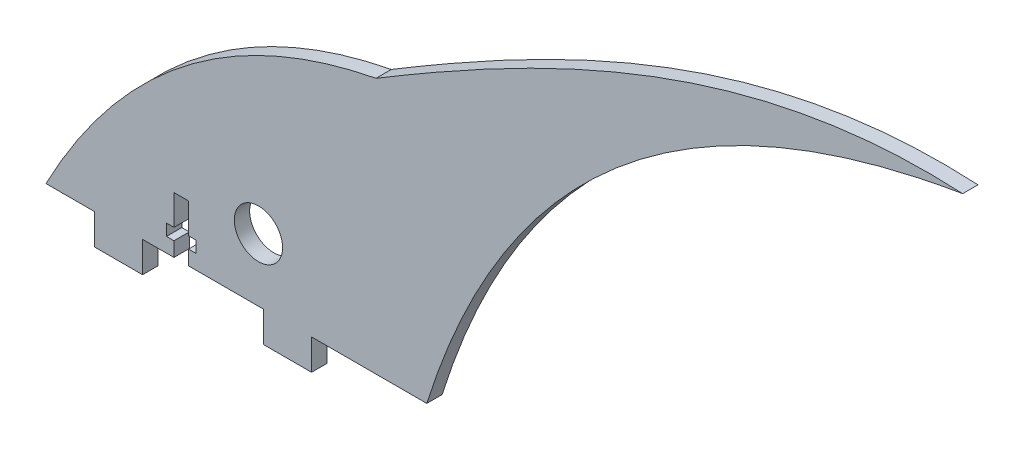
ISO-10303-21;
HEADER;
FILE_DESCRIPTION(('STEP AP214'),'2;1');
FILE_NAME('part.step','',(''),(''),'','','');
FILE_SCHEMA(('AUTOMOTIVE_DESIGN { 1 0 10303 214 1 1 1 1 }'));
ENDSEC;
DATA;
#1=APPLICATION_CONTEXT('core data for automotive mechanical design processes');
#2=APPLICATION_PROTOCOL_DEFINITION('international standard','automotive_design',2000,#1);
#3=PRODUCT_CONTEXT('',#1,'mechanical');
#4=PRODUCT('Part','Part','',(#3));
#5=PRODUCT_RELATED_PRODUCT_CATEGORY('part','',(#4));
#6=PRODUCT_DEFINITION_FORMATION('','',#4);
#7=PRODUCT_DEFINITION_CONTEXT('part definition',#1,'design');
#8=PRODUCT_DEFINITION('design','',#6,#7);
#9=PRODUCT_DEFINITION_SHAPE('','',#8);
#10=(LENGTH_UNIT() NAMED_UNIT(*) SI_UNIT(.MILLI.,.METRE.));
#11=(NAMED_UNIT(*) PLANE_ANGLE_UNIT() SI_UNIT($,.RADIAN.));
#12=(NAMED_UNIT(*) SI_UNIT($,.STERADIAN.) SOLID_ANGLE_UNIT());
#13=UNCERTAINTY_MEASURE_WITH_UNIT(LENGTH_MEASURE(1.E-05),#10,'distance_accuracy_value','');
#14=(GEOMETRIC_REPRESENTATION_CONTEXT(3) GLOBAL_UNCERTAINTY_ASSIGNED_CONTEXT((#13)) GLOBAL_UNIT_ASSIGNED_CONTEXT((#10,
#11,#12)) REPRESENTATION_CONTEXT('',''));
#15=CARTESIAN_POINT('',(0.,0.,0.));
#16=DIRECTION('',(0.,0.,1.));
#17=DIRECTION('',(1.,0.,0.));
#18=AXIS2_PLACEMENT_3D('',#15,#16,#17);
#19=CARTESIAN_POINT('',(-100.609869353649,-40.6042197841452,3.175));
#20=DIRECTION('',(0.,1.,0.));
#21=DIRECTION('',(0.,0.,1.));
#22=AXIS2_PLACEMENT_3D('',#19,#20,#21);
#23=PLANE('',#22);
#24=DIRECTION('',(1.,0.,0.));
#25=VECTOR('',#24,1.);
#26=CARTESIAN_POINT('',(-100.609869353649,-40.6042197841452,3.175));
#27=LINE('',#26,#25);
#28=CARTESIAN_POINT('',(-71.1098693536488,-40.6042197841452,3.175));
#29=VERTEX_POINT('',#28);
#30=CARTESIAN_POINT('',(-55.6098693536488,-40.6042197841452,3.175));
#31=VERTEX_POINT('',#30);
#32=EDGE_CURVE('E537',#29,#31,#27,.T.);
#33=ORIENTED_EDGE('',*,*,#32,.F.);
#34=DIRECTION('',(0.,0.,1.));
#35=VECTOR('',#34,1.);
#36=CARTESIAN_POINT('',(-71.1098693536488,-40.6042197841452,0.));
#37=LINE('',#36,#35);
#38=CARTESIAN_POINT('',(-71.1098693536488,-40.6042197841452,0.));
#39=VERTEX_POINT('',#38);
#40=EDGE_CURVE('E330',#39,#29,#37,.T.);
#41=ORIENTED_EDGE('',*,*,#40,.F.);
#42=DIRECTION('',(1.,0.,0.));
#43=VECTOR('',#42,1.);
#44=CARTESIAN_POINT('',(-100.609869353649,-40.6042197841452,0.));
#45=LINE('',#44,#43);
#46=CARTESIAN_POINT('',(-55.6098693536488,-40.6042197841452,0.));
#47=VERTEX_POINT('',#46);
#48=EDGE_CURVE('E582',#39,#47,#45,.T.);
#49=ORIENTED_EDGE('',*,*,#48,.T.);
#50=DIRECTION('',(0.,0.,1.));
#51=VECTOR('',#50,1.);
#52=CARTESIAN_POINT('',(-55.6098693536488,-40.6042197841452,0.));
#53=LINE('',#52,#51);
#54=EDGE_CURVE('E367',#47,#31,#53,.T.);
#55=ORIENTED_EDGE('',*,*,#54,.T.);
#56=EDGE_LOOP('',(#33,#41,#49,#55));
#57=FACE_BOUND('',#56,.T.);
#58=ADVANCED_FACE('F38',(#57),#23,.F.);
#59=CARTESIAN_POINT('',(-80.6098693536488,-40.6042197841452,0.));
#60=VERTEX_POINT('',#59);
#61=CARTESIAN_POINT('',(-74.1098693536488,-40.6042197841452,0.));
#62=VERTEX_POINT('',#61);
#63=EDGE_CURVE('E583',#60,#62,#45,.T.);
#64=ORIENTED_EDGE('',*,*,#63,.T.);
#65=DIRECTION('',(0.,0.,1.));
#66=VECTOR('',#65,1.);
#67=CARTESIAN_POINT('',(-74.1098693536488,-40.6042197841452,0.));
#68=LINE('',#67,#66);
#69=CARTESIAN_POINT('',(-74.1098693536488,-40.6042197841452,3.175));
#70=VERTEX_POINT('',#69);
#71=EDGE_CURVE('E55',#62,#70,#68,.T.);
#72=ORIENTED_EDGE('',*,*,#71,.T.);
#73=CARTESIAN_POINT('',(-80.6098693536488,-40.6042197841452,3.175));
#74=VERTEX_POINT('',#73);
#75=EDGE_CURVE('E544',#74,#70,#27,.T.);
#76=ORIENTED_EDGE('',*,*,#75,.F.);
#77=DIRECTION('',(0.,0.,1.));
#78=VECTOR('',#77,1.);
#79=CARTESIAN_POINT('',(-80.6098693536488,-40.6042197841452,0.));
#80=LINE('',#79,#78);
#81=EDGE_CURVE('E403',#60,#74,#80,.T.);
#82=ORIENTED_EDGE('',*,*,#81,.F.);
#83=EDGE_LOOP('',(#64,#72,#76,#82));
#84=FACE_BOUND('',#83,.T.);
#85=ADVANCED_FACE('F529',(#84),#23,.F.);
#86=CARTESIAN_POINT('',(-45.6098693536488,-40.6042197841452,3.175));
#87=VERTEX_POINT('',#86);
#88=CARTESIAN_POINT('',(-21.7448416777128,-40.6042197841452,3.175));
#89=VERTEX_POINT('',#88);
#90=EDGE_CURVE('E63',#87,#89,#27,.T.);
#91=ORIENTED_EDGE('',*,*,#90,.F.);
#92=DIRECTION('',(0.,0.,1.));
#93=VECTOR('',#92,1.);
#94=CARTESIAN_POINT('',(-45.6098693536488,-40.6042197841452,0.));
#95=LINE('',#94,#93);
#96=CARTESIAN_POINT('',(-45.6098693536488,-40.6042197841452,0.));
#97=VERTEX_POINT('',#96);
#98=EDGE_CURVE('E372',#97,#87,#95,.T.);
#99=ORIENTED_EDGE('',*,*,#98,.F.);
#100=CARTESIAN_POINT('',(-21.7448416777128,-40.6042197841452,0.));
#101=VERTEX_POINT('',#100);
#102=EDGE_CURVE('E579',#97,#101,#45,.T.);
#103=ORIENTED_EDGE('',*,*,#102,.T.);
#104=DIRECTION('',(0.,0.,-1.));
#105=VECTOR('',#104,1.);
#106=CARTESIAN_POINT('',(-21.7448416777128,-40.6042197841452,3.175));
#107=LINE('',#106,#105);
#108=EDGE_CURVE('E552',#89,#101,#107,.T.);
#109=ORIENTED_EDGE('',*,*,#108,.F.);
#110=EDGE_LOOP('',(#91,#99,#103,#109));
#111=FACE_BOUND('',#110,.T.);
#112=ADVANCED_FACE('F453',(#111),#23,.F.);
#113=CARTESIAN_POINT('',(-21.7448416777128,-40.6042197841452,3.175));
#114=CARTESIAN_POINT('',(2.91962202011833,37.9893924054995,3.175));
#115=CARTESIAN_POINT('',(89.2389787737174,52.5113001322188,3.175));
#116=B_SPLINE_CURVE_WITH_KNOTS('',2,(#113,#114,#115),.UNSPECIFIED.,.F.,.F.,(3,3),(0.,1.),.UNSPECIFIED.);
#117=DIRECTION('',(0.,0.,-1.));
#118=VECTOR('',#117,1.);
#119=SURFACE_OF_LINEAR_EXTRUSION('',#116,#118);
#120=CARTESIAN_POINT('',(-21.7448416777128,-40.6042197841452,0.));
#121=CARTESIAN_POINT('',(2.91962202011833,37.9893924054995,0.));
#122=CARTESIAN_POINT('',(89.2389787737174,52.5113001322188,0.));
#123=B_SPLINE_CURVE_WITH_KNOTS('',2,(#120,#121,#122),.UNSPECIFIED.,.F.,.F.,(3,3),(0.,1.),.UNSPECIFIED.);
#124=CARTESIAN_POINT('',(89.2389787737174,52.5113001322188,0.));
#125=VERTEX_POINT('',#124);
#126=EDGE_CURVE('E406',#101,#125,#123,.T.);
#127=ORIENTED_EDGE('',*,*,#126,.T.);
#128=DIRECTION('',(0.,0.,-1.));
#129=VECTOR('',#128,1.);
#130=CARTESIAN_POINT('',(89.2389787737174,52.5113001322188,3.175));
#131=LINE('',#130,#129);
#132=CARTESIAN_POINT('',(89.2389787737174,52.5113001322188,3.175));
#133=VERTEX_POINT('',#132);
#134=EDGE_CURVE('E11',#133,#125,#131,.T.);
#135=ORIENTED_EDGE('',*,*,#134,.F.);
#136=EDGE_CURVE('E415',#89,#133,#116,.T.);
#137=ORIENTED_EDGE('',*,*,#136,.F.);
#138=ORIENTED_EDGE('',*,*,#108,.T.);
#139=EDGE_LOOP('',(#127,#135,#137,#138));
#140=FACE_BOUND('',#139,.T.);
#141=ADVANCED_FACE('F40',(#140),#119,.F.);
#142=CARTESIAN_POINT('',(89.2389787737174,52.5113001322188,3.175));
#143=CARTESIAN_POINT('',(45.2135954606768,54.960877805964,3.175));
#144=CARTESIAN_POINT('',(4.52272738763104,34.5925622247039,3.175));
#145=CARTESIAN_POINT('',(-32.2599982329968,12.458533918971,3.175));
#146=B_SPLINE_CURVE_WITH_KNOTS('',3,(#142,#143,#144,#145),.UNSPECIFIED.,.F.,.F.,(4,4),(0.,1.),.UNSPECIFIED.);
#147=DIRECTION('',(0.,0.,-1.));
#148=VECTOR('',#147,1.);
#149=SURFACE_OF_LINEAR_EXTRUSION('',#146,#148);
#150=CARTESIAN_POINT('',(89.2389787737174,52.5113001322188,0.));
#151=CARTESIAN_POINT('',(45.2135954606768,54.960877805964,0.));
#152=CARTESIAN_POINT('',(4.52272738763104,34.5925622247039,0.));
#153=CARTESIAN_POINT('',(-32.2599982329968,12.458533918971,0.));
#154=B_SPLINE_CURVE_WITH_KNOTS('',3,(#150,#151,#152,#153),.UNSPECIFIED.,.F.,.F.,(4,4),(0.,1.),.UNSPECIFIED.);
#155=CARTESIAN_POINT('',(-32.2599982329968,12.458533918971,0.));
#156=VERTEX_POINT('',#155);
#157=EDGE_CURVE('E575',#125,#156,#154,.T.);
#158=ORIENTED_EDGE('',*,*,#157,.T.);
#159=DIRECTION('',(0.,0.,-1.));
#160=VECTOR('',#159,1.);
#161=CARTESIAN_POINT('',(-32.2599982329968,12.458533918971,3.175));
#162=LINE('',#161,#160);
#163=CARTESIAN_POINT('',(-32.2599982329968,12.458533918971,3.175));
#164=VERTEX_POINT('',#163);
#165=EDGE_CURVE('E48',#164,#156,#162,.T.);
#166=ORIENTED_EDGE('',*,*,#165,.F.);
#167=EDGE_CURVE('E422',#133,#164,#146,.T.);
#168=ORIENTED_EDGE('',*,*,#167,.F.);
#169=ORIENTED_EDGE('',*,*,#134,.T.);
#170=EDGE_LOOP('',(#158,#166,#168,#169));
#171=FACE_BOUND('',#170,.T.);
#172=ADVANCED_FACE('F440',(#171),#149,.F.);
#173=CARTESIAN_POINT('',(-32.2599982329968,12.458533918971,3.175));
#174=CARTESIAN_POINT('',(-77.388125592225,3.70588688352247,3.175));
#175=CARTESIAN_POINT('',(-100.609869353649,-40.6042197841452,3.175));
#176=B_SPLINE_CURVE_WITH_KNOTS('',2,(#173,#174,#175),.UNSPECIFIED.,.F.,.F.,(3,3),(0.,1.),.UNSPECIFIED.);
#177=DIRECTION('',(0.,0.,-1.));
#178=VECTOR('',#177,1.);
#179=SURFACE_OF_LINEAR_EXTRUSION('',#176,#178);
#180=CARTESIAN_POINT('',(-32.2599982329968,12.458533918971,0.));
#181=CARTESIAN_POINT('',(-77.388125592225,3.70588688352247,0.));
#182=CARTESIAN_POINT('',(-100.609869353649,-40.6042197841452,0.));
#183=B_SPLINE_CURVE_WITH_KNOTS('',2,(#180,#181,#182),.UNSPECIFIED.,.F.,.F.,(3,3),(0.,1.),.UNSPECIFIED.);
#184=CARTESIAN_POINT('',(-100.609869353649,-40.6042197841452,0.));
#185=VERTEX_POINT('',#184);
#186=EDGE_CURVE('E573',#156,#185,#183,.T.);
#187=ORIENTED_EDGE('',*,*,#186,.T.);
#188=DIRECTION('',(0.,0.,-1.));
#189=VECTOR('',#188,1.);
#190=CARTESIAN_POINT('',(-100.609869353649,-40.6042197841452,3.175));
#191=LINE('',#190,#189);
#192=CARTESIAN_POINT('',(-100.609869353649,-40.6042197841452,3.175));
#193=VERTEX_POINT('',#192);
#194=EDGE_CURVE('E556',#193,#185,#191,.T.);
#195=ORIENTED_EDGE('',*,*,#194,.F.);
#196=EDGE_CURVE('E432',#164,#193,#176,.T.);
#197=ORIENTED_EDGE('',*,*,#196,.F.);
#198=ORIENTED_EDGE('',*,*,#165,.T.);
#199=EDGE_LOOP('',(#187,#195,#197,#198));
#200=FACE_BOUND('',#199,.T.);
#201=ADVANCED_FACE('F443',(#200),#179,.F.);
#202=CARTESIAN_POINT('',(-90.6098693536488,-40.6042197841452,0.));
#203=VERTEX_POINT('',#202);
#204=EDGE_CURVE('E423',#185,#203,#45,.T.);
#205=ORIENTED_EDGE('',*,*,#204,.T.);
#206=DIRECTION('',(0.,0.,1.));
#207=VECTOR('',#206,1.);
#208=CARTESIAN_POINT('',(-90.6098693536488,-40.6042197841452,0.));
#209=LINE('',#208,#207);
#210=CARTESIAN_POINT('',(-90.6098693536488,-40.6042197841452,3.175));
#211=VERTEX_POINT('',#210);
#212=EDGE_CURVE('E392',#203,#211,#209,.T.);
#213=ORIENTED_EDGE('',*,*,#212,.T.);
#214=EDGE_CURVE('E545',#193,#211,#27,.T.);
#215=ORIENTED_EDGE('',*,*,#214,.F.);
#216=ORIENTED_EDGE('',*,*,#194,.T.);
#217=EDGE_LOOP('',(#205,#213,#215,#216));
#218=FACE_BOUND('',#217,.T.);
#219=ADVANCED_FACE('F447',(#218),#23,.F.);
#220=CARTESIAN_POINT('',(18.3333452840603,21.9714662897682,3.175));
#221=DIRECTION('',(0.,0.,-1.));
#222=DIRECTION('',(-1.,0.,0.));
#223=AXIS2_PLACEMENT_3D('',#220,#221,#222);
#224=PLANE('',#223);
#225=CARTESIAN_POINT('',(-56.6098693536488,-27.6042197841452,3.175));
#226=DIRECTION('',(0.,0.,1.));
#227=DIRECTION('',(1.,0.,0.));
#228=AXIS2_PLACEMENT_3D('',#225,#226,#227);
#229=CIRCLE('',#228,5.);
#230=CARTESIAN_POINT('',(-51.6098693536488,-27.6042197841452,3.175));
#231=VERTEX_POINT('',#230);
#232=EDGE_CURVE('E305',#231,#231,#229,.T.);
#233=ORIENTED_EDGE('',*,*,#232,.F.);
#234=EDGE_LOOP('',(#233));
#235=FACE_BOUND('',#234,.T.);
#236=DIRECTION('',(1.,0.,0.));
#237=VECTOR('',#236,1.);
#238=CARTESIAN_POINT('',(-71.1098693536488,-37.6042197841452,3.175));
#239=LINE('',#238,#237);
#240=CARTESIAN_POINT('',(-71.1098693536488,-37.6042197841452,3.175));
#241=VERTEX_POINT('',#240);
#242=CARTESIAN_POINT('',(-69.5598693536488,-37.6042197841452,3.175));
#243=VERTEX_POINT('',#242);
#244=EDGE_CURVE('E275',#241,#243,#239,.T.);
#245=ORIENTED_EDGE('',*,*,#244,.F.);
#246=DIRECTION('',(0.,1.,0.));
#247=VECTOR('',#246,1.);
#248=CARTESIAN_POINT('',(-71.1098693536488,-37.6042197841452,3.175));
#249=LINE('',#248,#247);
#250=EDGE_CURVE('E271',#29,#241,#249,.T.);
#251=ORIENTED_EDGE('',*,*,#250,.F.);
#252=ORIENTED_EDGE('',*,*,#32,.T.);
#253=DIRECTION('',(0.,-1.,0.));
#254=VECTOR('',#253,1.);
#255=CARTESIAN_POINT('',(-55.6098693536488,-46.9542197841452,3.175));
#256=LINE('',#255,#254);
#257=CARTESIAN_POINT('',(-55.6098693536488,-46.9542197841452,3.175));
#258=VERTEX_POINT('',#257);
#259=EDGE_CURVE('E339',#31,#258,#256,.T.);
#260=ORIENTED_EDGE('',*,*,#259,.T.);
#261=DIRECTION('',(1.,0.,0.));
#262=VECTOR('',#261,1.);
#263=CARTESIAN_POINT('',(-45.6098693536488,-46.9542197841452,3.175));
#264=LINE('',#263,#262);
#265=CARTESIAN_POINT('',(-45.6098693536488,-46.9542197841452,3.175));
#266=VERTEX_POINT('',#265);
#267=EDGE_CURVE('E360',#258,#266,#264,.T.);
#268=ORIENTED_EDGE('',*,*,#267,.T.);
#269=DIRECTION('',(0.,1.,0.));
#270=VECTOR('',#269,1.);
#271=CARTESIAN_POINT('',(-45.6098693536488,-40.6042197841452,3.175));
#272=LINE('',#271,#270);
#273=EDGE_CURVE('E348',#266,#87,#272,.T.);
#274=ORIENTED_EDGE('',*,*,#273,.T.);
#275=ORIENTED_EDGE('',*,*,#90,.T.);
#276=ORIENTED_EDGE('',*,*,#136,.T.);
#277=ORIENTED_EDGE('',*,*,#167,.T.);
#278=ORIENTED_EDGE('',*,*,#196,.T.);
#279=ORIENTED_EDGE('',*,*,#214,.T.);
#280=DIRECTION('',(0.,-1.,0.));
#281=VECTOR('',#280,1.);
#282=CARTESIAN_POINT('',(-90.6098693536488,-40.6042197841452,3.175));
#283=LINE('',#282,#281);
#284=CARTESIAN_POINT('',(-90.6098693536488,-46.9542197841452,3.175));
#285=VERTEX_POINT('',#284);
#286=EDGE_CURVE('E371',#211,#285,#283,.T.);
#287=ORIENTED_EDGE('',*,*,#286,.T.);
#288=DIRECTION('',(1.,0.,0.));
#289=VECTOR('',#288,1.);
#290=CARTESIAN_POINT('',(-90.6098693536488,-46.9542197841452,3.175));
#291=LINE('',#290,#289);
#292=CARTESIAN_POINT('',(-80.6098693536488,-46.9542197841452,3.175));
#293=VERTEX_POINT('',#292);
#294=EDGE_CURVE('E396',#285,#293,#291,.T.);
#295=ORIENTED_EDGE('',*,*,#294,.T.);
#296=DIRECTION('',(0.,1.,0.));
#297=VECTOR('',#296,1.);
#298=CARTESIAN_POINT('',(-80.6098693536488,-46.9542197841452,3.175));
#299=LINE('',#298,#297);
#300=EDGE_CURVE('E385',#293,#74,#299,.T.);
#301=ORIENTED_EDGE('',*,*,#300,.T.);
#302=ORIENTED_EDGE('',*,*,#75,.T.);
#303=DIRECTION('',(0.,-1.,0.));
#304=VECTOR('',#303,1.);
#305=CARTESIAN_POINT('',(-74.1098693536488,-37.6042197841452,3.175));
#306=LINE('',#305,#304);
#307=CARTESIAN_POINT('',(-74.1098693536488,-37.6042197841452,3.175));
#308=VERTEX_POINT('',#307);
#309=EDGE_CURVE('E268',#308,#70,#306,.T.);
#310=ORIENTED_EDGE('',*,*,#309,.F.);
#311=DIRECTION('',(1.,0.,0.));
#312=VECTOR('',#311,1.);
#313=CARTESIAN_POINT('',(-74.1098693536488,-37.6042197841452,3.175));
#314=LINE('',#313,#312);
#315=CARTESIAN_POINT('',(-75.6598693536488,-37.6042197841452,3.175));
#316=VERTEX_POINT('',#315);
#317=EDGE_CURVE('E209',#316,#308,#314,.T.);
#318=ORIENTED_EDGE('',*,*,#317,.F.);
#319=DIRECTION('',(0.,-1.,0.));
#320=VECTOR('',#319,1.);
#321=CARTESIAN_POINT('',(-75.6598693536488,-37.6042197841452,3.175));
#322=LINE('',#321,#320);
#323=CARTESIAN_POINT('',(-75.6598693536488,-35.2042197841452,3.175));
#324=VERTEX_POINT('',#323);
#325=EDGE_CURVE('E228',#324,#316,#322,.T.);
#326=ORIENTED_EDGE('',*,*,#325,.F.);
#327=DIRECTION('',(-1.,0.,0.));
#328=VECTOR('',#327,1.);
#329=CARTESIAN_POINT('',(-75.6598693536488,-35.2042197841452,3.175));
#330=LINE('',#329,#328);
#331=CARTESIAN_POINT('',(-74.1098693536488,-35.2042197841452,3.175));
#332=VERTEX_POINT('',#331);
#333=EDGE_CURVE('E232',#332,#324,#330,.T.);
#334=ORIENTED_EDGE('',*,*,#333,.F.);
#335=DIRECTION('',(0.,-1.,0.));
#336=VECTOR('',#335,1.);
#337=CARTESIAN_POINT('',(-74.1098693536488,-35.2042197841452,3.175));
#338=LINE('',#337,#336);
#339=CARTESIAN_POINT('',(-74.1098693536488,-28.9542197841452,3.175));
#340=VERTEX_POINT('',#339);
#341=EDGE_CURVE('E295',#340,#332,#338,.T.);
#342=ORIENTED_EDGE('',*,*,#341,.F.);
#343=DIRECTION('',(-1.,0.,0.));
#344=VECTOR('',#343,1.);
#345=CARTESIAN_POINT('',(-74.1098693536488,-28.9542197841452,3.175));
#346=LINE('',#345,#344);
#347=CARTESIAN_POINT('',(-71.1098693536488,-28.9542197841452,3.175));
#348=VERTEX_POINT('',#347);
#349=EDGE_CURVE('E291',#348,#340,#346,.T.);
#350=ORIENTED_EDGE('',*,*,#349,.F.);
#351=DIRECTION('',(0.,1.,0.));
#352=VECTOR('',#351,1.);
#353=CARTESIAN_POINT('',(-71.1098693536488,-35.2042197841452,3.175));
#354=LINE('',#353,#352);
#355=CARTESIAN_POINT('',(-71.1098693536488,-35.2042197841452,3.175));
#356=VERTEX_POINT('',#355);
#357=EDGE_CURVE('E287',#356,#348,#354,.T.);
#358=ORIENTED_EDGE('',*,*,#357,.F.);
#359=DIRECTION('',(-1.,0.,0.));
#360=VECTOR('',#359,1.);
#361=CARTESIAN_POINT('',(-69.5598693536488,-35.2042197841452,3.175));
#362=LINE('',#361,#360);
#363=CARTESIAN_POINT('',(-69.5598693536488,-35.2042197841452,3.175));
#364=VERTEX_POINT('',#363);
#365=EDGE_CURVE('E283',#364,#356,#362,.T.);
#366=ORIENTED_EDGE('',*,*,#365,.F.);
#367=DIRECTION('',(0.,1.,0.));
#368=VECTOR('',#367,1.);
#369=CARTESIAN_POINT('',(-69.5598693536488,-37.6042197841452,3.175));
#370=LINE('',#369,#368);
#371=EDGE_CURVE('E279',#243,#364,#370,.T.);
#372=ORIENTED_EDGE('',*,*,#371,.F.);
#373=EDGE_LOOP('',(#245,#251,#252,#260,#268,#274,#275,#276,#277,#278,#279,#287,#295,#301,#302,
#310,#318,#326,#334,#342,#350,#358,#366,#372));
#374=FACE_BOUND('',#373,.T.);
#375=ADVANCED_FACE('F451',(#235,#374),#224,.F.);
#376=CARTESIAN_POINT('',(18.3333452840603,21.9714662897682,0.));
#377=DIRECTION('',(0.,0.,-1.));
#378=DIRECTION('',(-1.,0.,0.));
#379=AXIS2_PLACEMENT_3D('',#376,#377,#378);
#380=PLANE('',#379);
#381=DIRECTION('',(0.,1.,0.));
#382=VECTOR('',#381,1.);
#383=CARTESIAN_POINT('',(-71.1098693536488,-37.6042197841452,0.));
#384=LINE('',#383,#382);
#385=CARTESIAN_POINT('',(-71.1098693536488,-37.6042197841452,0.));
#386=VERTEX_POINT('',#385);
#387=EDGE_CURVE('E220',#39,#386,#384,.T.);
#388=ORIENTED_EDGE('',*,*,#387,.T.);
#389=DIRECTION('',(1.,0.,0.));
#390=VECTOR('',#389,1.);
#391=CARTESIAN_POINT('',(-71.1098693536488,-37.6042197841452,0.));
#392=LINE('',#391,#390);
#393=CARTESIAN_POINT('',(-69.5598693536488,-37.6042197841452,0.));
#394=VERTEX_POINT('',#393);
#395=EDGE_CURVE('E237',#386,#394,#392,.T.);
#396=ORIENTED_EDGE('',*,*,#395,.T.);
#397=DIRECTION('',(0.,1.,0.));
#398=VECTOR('',#397,1.);
#399=CARTESIAN_POINT('',(-69.5598693536488,-37.6042197841452,0.));
#400=LINE('',#399,#398);
#401=CARTESIAN_POINT('',(-69.5598693536488,-35.2042197841452,0.));
#402=VERTEX_POINT('',#401);
#403=EDGE_CURVE('E241',#394,#402,#400,.T.);
#404=ORIENTED_EDGE('',*,*,#403,.T.);
#405=DIRECTION('',(-1.,0.,0.));
#406=VECTOR('',#405,1.);
#407=CARTESIAN_POINT('',(-69.5598693536488,-35.2042197841452,0.));
#408=LINE('',#407,#406);
#409=CARTESIAN_POINT('',(-71.1098693536488,-35.2042197841452,0.));
#410=VERTEX_POINT('',#409);
#411=EDGE_CURVE('E245',#402,#410,#408,.T.);
#412=ORIENTED_EDGE('',*,*,#411,.T.);
#413=DIRECTION('',(0.,1.,0.));
#414=VECTOR('',#413,1.);
#415=CARTESIAN_POINT('',(-71.1098693536488,-35.2042197841452,0.));
#416=LINE('',#415,#414);
#417=CARTESIAN_POINT('',(-71.1098693536488,-28.9542197841452,0.));
#418=VERTEX_POINT('',#417);
#419=EDGE_CURVE('E249',#410,#418,#416,.T.);
#420=ORIENTED_EDGE('',*,*,#419,.T.);
#421=DIRECTION('',(-1.,0.,0.));
#422=VECTOR('',#421,1.);
#423=CARTESIAN_POINT('',(-74.1098693536488,-28.9542197841452,0.));
#424=LINE('',#423,#422);
#425=CARTESIAN_POINT('',(-74.1098693536488,-28.9542197841452,0.));
#426=VERTEX_POINT('',#425);
#427=EDGE_CURVE('E253',#418,#426,#424,.T.);
#428=ORIENTED_EDGE('',*,*,#427,.T.);
#429=DIRECTION('',(0.,-1.,0.));
#430=VECTOR('',#429,1.);
#431=CARTESIAN_POINT('',(-74.1098693536488,-35.2042197841452,0.));
#432=LINE('',#431,#430);
#433=CARTESIAN_POINT('',(-74.1098693536488,-35.2042197841452,0.));
#434=VERTEX_POINT('',#433);
#435=EDGE_CURVE('E257',#426,#434,#432,.T.);
#436=ORIENTED_EDGE('',*,*,#435,.T.);
#437=DIRECTION('',(-1.,0.,0.));
#438=VECTOR('',#437,1.);
#439=CARTESIAN_POINT('',(-75.6598693536488,-35.2042197841452,0.));
#440=LINE('',#439,#438);
#441=CARTESIAN_POINT('',(-75.6598693536488,-35.2042197841452,0.));
#442=VERTEX_POINT('',#441);
#443=EDGE_CURVE('E261',#434,#442,#440,.T.);
#444=ORIENTED_EDGE('',*,*,#443,.T.);
#445=DIRECTION('',(0.,-1.,0.));
#446=VECTOR('',#445,1.);
#447=CARTESIAN_POINT('',(-75.6598693536488,-37.6042197841452,0.));
#448=LINE('',#447,#446);
#449=CARTESIAN_POINT('',(-75.6598693536488,-37.6042197841452,0.));
#450=VERTEX_POINT('',#449);
#451=EDGE_CURVE('E212',#442,#450,#448,.T.);
#452=ORIENTED_EDGE('',*,*,#451,.T.);
#453=DIRECTION('',(1.,0.,0.));
#454=VECTOR('',#453,1.);
#455=CARTESIAN_POINT('',(-74.1098693536488,-37.6042197841452,0.));
#456=LINE('',#455,#454);
#457=CARTESIAN_POINT('',(-74.1098693536488,-37.6042197841452,0.));
#458=VERTEX_POINT('',#457);
#459=EDGE_CURVE('E206',#450,#458,#456,.T.);
#460=ORIENTED_EDGE('',*,*,#459,.T.);
#461=DIRECTION('',(0.,-1.,0.));
#462=VECTOR('',#461,1.);
#463=CARTESIAN_POINT('',(-74.1098693536488,-37.6042197841452,0.));
#464=LINE('',#463,#462);
#465=EDGE_CURVE('E214',#458,#62,#464,.T.);
#466=ORIENTED_EDGE('',*,*,#465,.T.);
#467=ORIENTED_EDGE('',*,*,#63,.F.);
#468=DIRECTION('',(0.,1.,0.));
#469=VECTOR('',#468,1.);
#470=CARTESIAN_POINT('',(-80.6098693536488,-46.9542197841452,0.));
#471=LINE('',#470,#469);
#472=CARTESIAN_POINT('',(-80.6098693536488,-46.9542197841452,0.));
#473=VERTEX_POINT('',#472);
#474=EDGE_CURVE('E389',#473,#60,#471,.T.);
#475=ORIENTED_EDGE('',*,*,#474,.F.);
#476=DIRECTION('',(1.,0.,0.));
#477=VECTOR('',#476,1.);
#478=CARTESIAN_POINT('',(-90.6098693536488,-46.9542197841452,0.));
#479=LINE('',#478,#477);
#480=CARTESIAN_POINT('',(-90.6098693536488,-46.9542197841452,0.));
#481=VERTEX_POINT('',#480);
#482=EDGE_CURVE('E384',#481,#473,#479,.T.);
#483=ORIENTED_EDGE('',*,*,#482,.F.);
#484=DIRECTION('',(0.,-1.,0.));
#485=VECTOR('',#484,1.);
#486=CARTESIAN_POINT('',(-90.6098693536488,-40.6042197841452,0.));
#487=LINE('',#486,#485);
#488=EDGE_CURVE('E380',#203,#481,#487,.T.);
#489=ORIENTED_EDGE('',*,*,#488,.F.);
#490=ORIENTED_EDGE('',*,*,#204,.F.);
#491=ORIENTED_EDGE('',*,*,#186,.F.);
#492=ORIENTED_EDGE('',*,*,#157,.F.);
#493=ORIENTED_EDGE('',*,*,#126,.F.);
#494=ORIENTED_EDGE('',*,*,#102,.F.);
#495=DIRECTION('',(0.,1.,0.));
#496=VECTOR('',#495,1.);
#497=CARTESIAN_POINT('',(-45.6098693536488,-40.6042197841452,0.));
#498=LINE('',#497,#496);
#499=CARTESIAN_POINT('',(-45.6098693536488,-46.9542197841452,0.));
#500=VERTEX_POINT('',#499);
#501=EDGE_CURVE('E352',#500,#97,#498,.T.);
#502=ORIENTED_EDGE('',*,*,#501,.F.);
#503=DIRECTION('',(1.,0.,0.));
#504=VECTOR('',#503,1.);
#505=CARTESIAN_POINT('',(-45.6098693536488,-46.9542197841452,0.));
#506=LINE('',#505,#504);
#507=CARTESIAN_POINT('',(-55.6098693536488,-46.9542197841452,0.));
#508=VERTEX_POINT('',#507);
#509=EDGE_CURVE('E347',#508,#500,#506,.T.);
#510=ORIENTED_EDGE('',*,*,#509,.F.);
#511=DIRECTION('',(0.,-1.,0.));
#512=VECTOR('',#511,1.);
#513=CARTESIAN_POINT('',(-55.6098693536488,-46.9542197841452,0.));
#514=LINE('',#513,#512);
#515=EDGE_CURVE('E343',#47,#508,#514,.T.);
#516=ORIENTED_EDGE('',*,*,#515,.F.);
#517=ORIENTED_EDGE('',*,*,#48,.F.);
#518=EDGE_LOOP('',(#388,#396,#404,#412,#420,#428,#436,#444,#452,#460,#466,#467,#475,#483,#489,
#490,#491,#492,#493,#494,#502,#510,#516,#517));
#519=FACE_BOUND('',#518,.T.);
#520=CARTESIAN_POINT('',(-56.6098693536488,-27.6042197841452,0.));
#521=DIRECTION('',(0.,0.,1.));
#522=DIRECTION('',(1.,0.,0.));
#523=AXIS2_PLACEMENT_3D('',#520,#521,#522);
#524=CIRCLE('',#523,5.);
#525=CARTESIAN_POINT('',(-51.6098693536488,-27.6042197841452,0.));
#526=VERTEX_POINT('',#525);
#527=EDGE_CURVE('E335',#526,#526,#524,.T.);
#528=ORIENTED_EDGE('',*,*,#527,.T.);
#529=EDGE_LOOP('',(#528));
#530=FACE_BOUND('',#529,.T.);
#531=ADVANCED_FACE('F223',(#519,#530),#380,.T.);
#532=CARTESIAN_POINT('',(-80.6098693536488,-46.9542197841452,0.));
#533=DIRECTION('',(1.,0.,0.));
#534=DIRECTION('',(0.,0.,-1.));
#535=AXIS2_PLACEMENT_3D('',#532,#533,#534);
#536=PLANE('',#535);
#537=ORIENTED_EDGE('',*,*,#300,.F.);
#538=DIRECTION('',(0.,0.,1.));
#539=VECTOR('',#538,1.);
#540=CARTESIAN_POINT('',(-80.6098693536488,-46.9542197841452,0.));
#541=LINE('',#540,#539);
#542=EDGE_CURVE('E407',#473,#293,#541,.T.);
#543=ORIENTED_EDGE('',*,*,#542,.F.);
#544=ORIENTED_EDGE('',*,*,#474,.T.);
#545=ORIENTED_EDGE('',*,*,#81,.T.);
#546=EDGE_LOOP('',(#537,#543,#544,#545));
#547=FACE_BOUND('',#546,.T.);
#548=ADVANCED_FACE('F456',(#547),#536,.T.);
#549=CARTESIAN_POINT('',(-90.6098693536488,-46.9542197841452,0.));
#550=DIRECTION('',(0.,-1.,0.));
#551=DIRECTION('',(0.,0.,-1.));
#552=AXIS2_PLACEMENT_3D('',#549,#550,#551);
#553=PLANE('',#552);
#554=ORIENTED_EDGE('',*,*,#294,.F.);
#555=DIRECTION('',(0.,0.,1.));
#556=VECTOR('',#555,1.);
#557=CARTESIAN_POINT('',(-90.6098693536488,-46.9542197841452,0.));
#558=LINE('',#557,#556);
#559=EDGE_CURVE('E410',#481,#285,#558,.T.);
#560=ORIENTED_EDGE('',*,*,#559,.F.);
#561=ORIENTED_EDGE('',*,*,#482,.T.);
#562=ORIENTED_EDGE('',*,*,#542,.T.);
#563=EDGE_LOOP('',(#554,#560,#561,#562));
#564=FACE_BOUND('',#563,.T.);
#565=ADVANCED_FACE('F464',(#564),#553,.T.);
#566=CARTESIAN_POINT('',(-90.6098693536488,-40.6042197841452,0.));
#567=DIRECTION('',(-1.,0.,0.));
#568=DIRECTION('',(0.,0.,1.));
#569=AXIS2_PLACEMENT_3D('',#566,#567,#568);
#570=PLANE('',#569);
#571=ORIENTED_EDGE('',*,*,#286,.F.);
#572=ORIENTED_EDGE('',*,*,#212,.F.);
#573=ORIENTED_EDGE('',*,*,#488,.T.);
#574=ORIENTED_EDGE('',*,*,#559,.T.);
#575=EDGE_LOOP('',(#571,#572,#573,#574));
#576=FACE_BOUND('',#575,.T.);
#577=ADVANCED_FACE('F460',(#576),#570,.T.);
#578=CARTESIAN_POINT('',(-55.6098693536488,-46.9542197841452,0.));
#579=DIRECTION('',(-1.,0.,0.));
#580=DIRECTION('',(0.,-1.,0.));
#581=AXIS2_PLACEMENT_3D('',#578,#579,#580);
#582=PLANE('',#581);
#583=ORIENTED_EDGE('',*,*,#259,.F.);
#584=ORIENTED_EDGE('',*,*,#54,.F.);
#585=ORIENTED_EDGE('',*,*,#515,.T.);
#586=DIRECTION('',(0.,0.,1.));
#587=VECTOR('',#586,1.);
#588=CARTESIAN_POINT('',(-55.6098693536488,-46.9542197841452,0.));
#589=LINE('',#588,#587);
#590=EDGE_CURVE('E356',#508,#258,#589,.T.);
#591=ORIENTED_EDGE('',*,*,#590,.T.);
#592=EDGE_LOOP('',(#583,#584,#585,#591));
#593=FACE_BOUND('',#592,.T.);
#594=ADVANCED_FACE('F463',(#593),#582,.T.);
#595=CARTESIAN_POINT('',(-45.6098693536488,-40.6042197841452,0.));
#596=DIRECTION('',(1.,0.,0.));
#597=DIRECTION('',(0.,0.,-1.));
#598=AXIS2_PLACEMENT_3D('',#595,#596,#597);
#599=PLANE('',#598);
#600=ORIENTED_EDGE('',*,*,#273,.F.);
#601=DIRECTION('',(0.,0.,1.));
#602=VECTOR('',#601,1.);
#603=CARTESIAN_POINT('',(-45.6098693536488,-46.9542197841452,0.));
#604=LINE('',#603,#602);
#605=EDGE_CURVE('E375',#500,#266,#604,.T.);
#606=ORIENTED_EDGE('',*,*,#605,.F.);
#607=ORIENTED_EDGE('',*,*,#501,.T.);
#608=ORIENTED_EDGE('',*,*,#98,.T.);
#609=EDGE_LOOP('',(#600,#606,#607,#608));
#610=FACE_BOUND('',#609,.T.);
#611=ADVANCED_FACE('F474',(#610),#599,.T.);
#612=CARTESIAN_POINT('',(-45.6098693536488,-46.9542197841452,0.));
#613=DIRECTION('',(0.,-1.,0.));
#614=DIRECTION('',(1.,0.,0.));
#615=AXIS2_PLACEMENT_3D('',#612,#613,#614);
#616=PLANE('',#615);
#617=ORIENTED_EDGE('',*,*,#267,.F.);
#618=ORIENTED_EDGE('',*,*,#590,.F.);
#619=ORIENTED_EDGE('',*,*,#509,.T.);
#620=ORIENTED_EDGE('',*,*,#605,.T.);
#621=EDGE_LOOP('',(#617,#618,#619,#620));
#622=FACE_BOUND('',#621,.T.);
#623=ADVANCED_FACE('F476',(#622),#616,.T.);
#624=CARTESIAN_POINT('',(-56.6098693536488,-27.6042197841452,0.));
#625=DIRECTION('',(0.,0.,1.));
#626=DIRECTION('',(1.,0.,0.));
#627=AXIS2_PLACEMENT_3D('',#624,#625,#626);
#628=CYLINDRICAL_SURFACE('',#627,5.);
#629=ORIENTED_EDGE('',*,*,#527,.F.);
#630=EDGE_LOOP('',(#629));
#631=FACE_BOUND('',#630,.T.);
#632=ORIENTED_EDGE('',*,*,#232,.T.);
#633=EDGE_LOOP('',(#632));
#634=FACE_BOUND('',#633,.T.);
#635=ADVANCED_FACE('F479',(#631,#634),#628,.F.);
#636=CARTESIAN_POINT('',(-74.1098693536488,-37.6042197841452,0.));
#637=DIRECTION('',(0.,-1.,0.));
#638=DIRECTION('',(0.,0.,-1.));
#639=AXIS2_PLACEMENT_3D('',#636,#637,#638);
#640=PLANE('',#639);
#641=ORIENTED_EDGE('',*,*,#317,.T.);
#642=DIRECTION('',(0.,0.,1.));
#643=VECTOR('',#642,1.);
#644=CARTESIAN_POINT('',(-74.1098693536488,-37.6042197841452,0.));
#645=LINE('',#644,#643);
#646=EDGE_CURVE('E203',#458,#308,#645,.T.);
#647=ORIENTED_EDGE('',*,*,#646,.F.);
#648=ORIENTED_EDGE('',*,*,#459,.F.);
#649=DIRECTION('',(0.,0.,1.));
#650=VECTOR('',#649,1.);
#651=CARTESIAN_POINT('',(-75.6598693536488,-37.6042197841452,0.));
#652=LINE('',#651,#650);
#653=EDGE_CURVE('E302',#450,#316,#652,.T.);
#654=ORIENTED_EDGE('',*,*,#653,.T.);
#655=EDGE_LOOP('',(#641,#647,#648,#654));
#656=FACE_BOUND('',#655,.T.);
#657=ADVANCED_FACE('F204',(#656),#640,.F.);
#658=CARTESIAN_POINT('',(-75.6598693536488,-37.6042197841452,0.));
#659=DIRECTION('',(-1.,0.,0.));
#660=DIRECTION('',(0.,-1.,0.));
#661=AXIS2_PLACEMENT_3D('',#658,#659,#660);
#662=PLANE('',#661);
#663=ORIENTED_EDGE('',*,*,#325,.T.);
#664=ORIENTED_EDGE('',*,*,#653,.F.);
#665=ORIENTED_EDGE('',*,*,#451,.F.);
#666=DIRECTION('',(0.,0.,1.));
#667=VECTOR('',#666,1.);
#668=CARTESIAN_POINT('',(-75.6598693536488,-35.2042197841452,0.));
#669=LINE('',#668,#667);
#670=EDGE_CURVE('E306',#442,#324,#669,.T.);
#671=ORIENTED_EDGE('',*,*,#670,.T.);
#672=EDGE_LOOP('',(#663,#664,#665,#671));
#673=FACE_BOUND('',#672,.T.);
#674=ADVANCED_FACE('F489',(#673),#662,.F.);
#675=CARTESIAN_POINT('',(-75.6598693536488,-35.2042197841452,0.));
#676=DIRECTION('',(0.,1.,0.));
#677=DIRECTION('',(0.,0.,1.));
#678=AXIS2_PLACEMENT_3D('',#675,#676,#677);
#679=PLANE('',#678);
#680=ORIENTED_EDGE('',*,*,#333,.T.);
#681=ORIENTED_EDGE('',*,*,#670,.F.);
#682=ORIENTED_EDGE('',*,*,#443,.F.);
#683=DIRECTION('',(0.,0.,1.));
#684=VECTOR('',#683,1.);
#685=CARTESIAN_POINT('',(-74.1098693536488,-35.2042197841452,0.));
#686=LINE('',#685,#684);
#687=EDGE_CURVE('E309',#434,#332,#686,.T.);
#688=ORIENTED_EDGE('',*,*,#687,.T.);
#689=EDGE_LOOP('',(#680,#681,#682,#688));
#690=FACE_BOUND('',#689,.T.);
#691=ADVANCED_FACE('F519',(#690),#679,.F.);
#692=CARTESIAN_POINT('',(-74.1098693536488,-35.2042197841452,0.));
#693=DIRECTION('',(-1.,0.,0.));
#694=DIRECTION('',(0.,0.,1.));
#695=AXIS2_PLACEMENT_3D('',#692,#693,#694);
#696=PLANE('',#695);
#697=ORIENTED_EDGE('',*,*,#341,.T.);
#698=ORIENTED_EDGE('',*,*,#687,.F.);
#699=ORIENTED_EDGE('',*,*,#435,.F.);
#700=DIRECTION('',(0.,0.,1.));
#701=VECTOR('',#700,1.);
#702=CARTESIAN_POINT('',(-74.1098693536488,-28.9542197841452,0.));
#703=LINE('',#702,#701);
#704=EDGE_CURVE('E312',#426,#340,#703,.T.);
#705=ORIENTED_EDGE('',*,*,#704,.T.);
#706=EDGE_LOOP('',(#697,#698,#699,#705));
#707=FACE_BOUND('',#706,.T.);
#708=ADVANCED_FACE('F515',(#707),#696,.F.);
#709=CARTESIAN_POINT('',(-74.1098693536488,-28.9542197841452,0.));
#710=DIRECTION('',(0.,1.,0.));
#711=DIRECTION('',(0.,0.,1.));
#712=AXIS2_PLACEMENT_3D('',#709,#710,#711);
#713=PLANE('',#712);
#714=ORIENTED_EDGE('',*,*,#349,.T.);
#715=ORIENTED_EDGE('',*,*,#704,.F.);
#716=ORIENTED_EDGE('',*,*,#427,.F.);
#717=DIRECTION('',(0.,0.,1.));
#718=VECTOR('',#717,1.);
#719=CARTESIAN_POINT('',(-71.1098693536488,-28.9542197841452,0.));
#720=LINE('',#719,#718);
#721=EDGE_CURVE('E315',#418,#348,#720,.T.);
#722=ORIENTED_EDGE('',*,*,#721,.T.);
#723=EDGE_LOOP('',(#714,#715,#716,#722));
#724=FACE_BOUND('',#723,.T.);
#725=ADVANCED_FACE('F511',(#724),#713,.F.);
#726=CARTESIAN_POINT('',(-71.1098693536488,-35.2042197841452,0.));
#727=DIRECTION('',(1.,0.,0.));
#728=DIRECTION('',(0.,0.,-1.));
#729=AXIS2_PLACEMENT_3D('',#726,#727,#728);
#730=PLANE('',#729);
#731=ORIENTED_EDGE('',*,*,#357,.T.);
#732=ORIENTED_EDGE('',*,*,#721,.F.);
#733=ORIENTED_EDGE('',*,*,#419,.F.);
#734=DIRECTION('',(0.,0.,1.));
#735=VECTOR('',#734,1.);
#736=CARTESIAN_POINT('',(-71.1098693536488,-35.2042197841452,0.));
#737=LINE('',#736,#735);
#738=EDGE_CURVE('E318',#410,#356,#737,.T.);
#739=ORIENTED_EDGE('',*,*,#738,.T.);
#740=EDGE_LOOP('',(#731,#732,#733,#739));
#741=FACE_BOUND('',#740,.T.);
#742=ADVANCED_FACE('F507',(#741),#730,.F.);
#743=CARTESIAN_POINT('',(-69.5598693536488,-35.2042197841452,0.));
#744=DIRECTION('',(0.,1.,0.));
#745=DIRECTION('',(0.,0.,1.));
#746=AXIS2_PLACEMENT_3D('',#743,#744,#745);
#747=PLANE('',#746);
#748=ORIENTED_EDGE('',*,*,#365,.T.);
#749=ORIENTED_EDGE('',*,*,#738,.F.);
#750=ORIENTED_EDGE('',*,*,#411,.F.);
#751=DIRECTION('',(0.,0.,1.));
#752=VECTOR('',#751,1.);
#753=CARTESIAN_POINT('',(-69.5598693536488,-35.2042197841452,0.));
#754=LINE('',#753,#752);
#755=EDGE_CURVE('E321',#402,#364,#754,.T.);
#756=ORIENTED_EDGE('',*,*,#755,.T.);
#757=EDGE_LOOP('',(#748,#749,#750,#756));
#758=FACE_BOUND('',#757,.T.);
#759=ADVANCED_FACE('F503',(#758),#747,.F.);
#760=CARTESIAN_POINT('',(-69.5598693536488,-37.6042197841452,0.));
#761=DIRECTION('',(1.,0.,0.));
#762=DIRECTION('',(0.,1.,0.));
#763=AXIS2_PLACEMENT_3D('',#760,#761,#762);
#764=PLANE('',#763);
#765=ORIENTED_EDGE('',*,*,#371,.T.);
#766=ORIENTED_EDGE('',*,*,#755,.F.);
#767=ORIENTED_EDGE('',*,*,#403,.F.);
#768=DIRECTION('',(0.,0.,1.));
#769=VECTOR('',#768,1.);
#770=CARTESIAN_POINT('',(-69.5598693536488,-37.6042197841452,0.));
#771=LINE('',#770,#769);
#772=EDGE_CURVE('E324',#394,#243,#771,.T.);
#773=ORIENTED_EDGE('',*,*,#772,.T.);
#774=EDGE_LOOP('',(#765,#766,#767,#773));
#775=FACE_BOUND('',#774,.T.);
#776=ADVANCED_FACE('F499',(#775),#764,.F.);
#777=CARTESIAN_POINT('',(-71.1098693536488,-37.6042197841452,0.));
#778=DIRECTION('',(0.,-1.,0.));
#779=DIRECTION('',(0.,0.,-1.));
#780=AXIS2_PLACEMENT_3D('',#777,#778,#779);
#781=PLANE('',#780);
#782=ORIENTED_EDGE('',*,*,#244,.T.);
#783=ORIENTED_EDGE('',*,*,#772,.F.);
#784=ORIENTED_EDGE('',*,*,#395,.F.);
#785=DIRECTION('',(0.,0.,1.));
#786=VECTOR('',#785,1.);
#787=CARTESIAN_POINT('',(-71.1098693536488,-37.6042197841452,0.));
#788=LINE('',#787,#786);
#789=EDGE_CURVE('E327',#386,#241,#788,.T.);
#790=ORIENTED_EDGE('',*,*,#789,.T.);
#791=EDGE_LOOP('',(#782,#783,#784,#790));
#792=FACE_BOUND('',#791,.T.);
#793=ADVANCED_FACE('F495',(#792),#781,.F.);
#794=CARTESIAN_POINT('',(-71.1098693536488,-37.6042197841452,0.));
#795=DIRECTION('',(1.,0.,0.));
#796=DIRECTION('',(0.,0.,-1.));
#797=AXIS2_PLACEMENT_3D('',#794,#795,#796);
#798=PLANE('',#797);
#799=ORIENTED_EDGE('',*,*,#250,.T.);
#800=ORIENTED_EDGE('',*,*,#789,.F.);
#801=ORIENTED_EDGE('',*,*,#387,.F.);
#802=ORIENTED_EDGE('',*,*,#40,.T.);
#803=EDGE_LOOP('',(#799,#800,#801,#802));
#804=FACE_BOUND('',#803,.T.);
#805=ADVANCED_FACE('F492',(#804),#798,.F.);
#806=CARTESIAN_POINT('',(-74.1098693536488,-37.6042197841452,0.));
#807=DIRECTION('',(-1.,0.,0.));
#808=DIRECTION('',(0.,0.,1.));
#809=AXIS2_PLACEMENT_3D('',#806,#807,#808);
#810=PLANE('',#809);
#811=ORIENTED_EDGE('',*,*,#309,.T.);
#812=ORIENTED_EDGE('',*,*,#71,.F.);
#813=ORIENTED_EDGE('',*,*,#465,.F.);
#814=ORIENTED_EDGE('',*,*,#646,.T.);
#815=EDGE_LOOP('',(#811,#812,#813,#814));
#816=FACE_BOUND('',#815,.T.);
#817=ADVANCED_FACE('F215',(#816),#810,.F.);
#818=CLOSED_SHELL('',(#58,#85,#112,#141,#172,#201,#219,#375,#531,#548,#565,#577,#594,#611,#623,
#635,#657,#674,#691,#708,#725,#742,#759,#776,#793,#805,#817));
#819=MANIFOLD_SOLID_BREP('B2',#818);
#820=ADVANCED_BREP_SHAPE_REPRESENTATION('',(#18,#819),#14);
#821=SHAPE_DEFINITION_REPRESENTATION(#9,#820);
ENDSEC;
END-ISO-10303-21;
